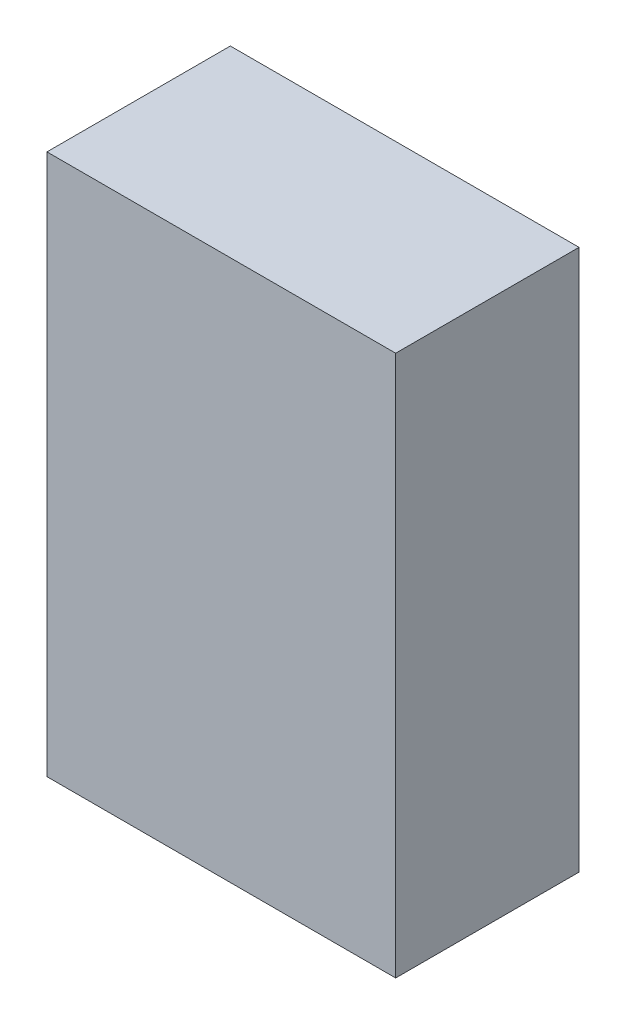
ISO-10303-21;
HEADER;
FILE_DESCRIPTION(('STEP AP214'),'2;1');
FILE_NAME('part.step','',(''),(''),'','','');
FILE_SCHEMA(('AUTOMOTIVE_DESIGN { 1 0 10303 214 1 1 1 1 }'));
ENDSEC;
DATA;
#1=APPLICATION_CONTEXT('core data for automotive mechanical design processes');
#2=APPLICATION_PROTOCOL_DEFINITION('international standard','automotive_design',2000,#1);
#3=PRODUCT_CONTEXT('',#1,'mechanical');
#4=PRODUCT('Part','Part','',(#3));
#5=PRODUCT_RELATED_PRODUCT_CATEGORY('part','',(#4));
#6=PRODUCT_DEFINITION_FORMATION('','',#4);
#7=PRODUCT_DEFINITION_CONTEXT('part definition',#1,'design');
#8=PRODUCT_DEFINITION('design','',#6,#7);
#9=PRODUCT_DEFINITION_SHAPE('','',#8);
#10=(LENGTH_UNIT() NAMED_UNIT(*) SI_UNIT(.MILLI.,.METRE.));
#11=(NAMED_UNIT(*) PLANE_ANGLE_UNIT() SI_UNIT($,.RADIAN.));
#12=(NAMED_UNIT(*) SI_UNIT($,.STERADIAN.) SOLID_ANGLE_UNIT());
#13=UNCERTAINTY_MEASURE_WITH_UNIT(LENGTH_MEASURE(1.E-05),#10,'distance_accuracy_value','');
#14=(GEOMETRIC_REPRESENTATION_CONTEXT(3) GLOBAL_UNCERTAINTY_ASSIGNED_CONTEXT((#13)) GLOBAL_UNIT_ASSIGNED_CONTEXT((#10,
#11,#12)) REPRESENTATION_CONTEXT('',''));
#15=CARTESIAN_POINT('',(0.,0.,0.));
#16=DIRECTION('',(0.,0.,1.));
#17=DIRECTION('',(1.,0.,0.));
#18=AXIS2_PLACEMENT_3D('',#15,#16,#17);
#19=CARTESIAN_POINT('',(-5.8,-9.,6.1));
#20=DIRECTION('',(0.,0.,1.));
#21=DIRECTION('',(1.,0.,0.));
#22=AXIS2_PLACEMENT_3D('',#19,#20,#21);
#23=PLANE('',#22);
#24=DIRECTION('',(0.,1.,0.));
#25=VECTOR('',#24,1.);
#26=CARTESIAN_POINT('',(-5.8,-9.,6.1));
#27=LINE('',#26,#25);
#28=CARTESIAN_POINT('',(-5.8,-9.,6.1));
#29=VERTEX_POINT('',#28);
#30=CARTESIAN_POINT('',(-5.8,9.,6.1));
#31=VERTEX_POINT('',#30);
#32=EDGE_CURVE('E88',#29,#31,#27,.T.);
#33=ORIENTED_EDGE('',*,*,#32,.F.);
#34=DIRECTION('',(1.,0.,0.));
#35=VECTOR('',#34,1.);
#36=CARTESIAN_POINT('',(-5.8,-9.,6.1));
#37=LINE('',#36,#35);
#38=CARTESIAN_POINT('',(5.8,-9.,6.1));
#39=VERTEX_POINT('',#38);
#40=EDGE_CURVE('E72',#29,#39,#37,.T.);
#41=ORIENTED_EDGE('',*,*,#40,.T.);
#42=DIRECTION('',(0.,1.,0.));
#43=VECTOR('',#42,1.);
#44=CARTESIAN_POINT('',(5.8,-9.,6.1));
#45=LINE('',#44,#43);
#46=CARTESIAN_POINT('',(5.8,9.,6.1));
#47=VERTEX_POINT('',#46);
#48=EDGE_CURVE('E18',#39,#47,#45,.T.);
#49=ORIENTED_EDGE('',*,*,#48,.T.);
#50=DIRECTION('',(1.,0.,0.));
#51=VECTOR('',#50,1.);
#52=CARTESIAN_POINT('',(-5.8,9.,6.1));
#53=LINE('',#52,#51);
#54=EDGE_CURVE('E9',#31,#47,#53,.T.);
#55=ORIENTED_EDGE('',*,*,#54,.F.);
#56=EDGE_LOOP('',(#33,#41,#49,#55));
#57=FACE_BOUND('',#56,.T.);
#58=ADVANCED_FACE('F14',(#57),#23,.T.);
#59=CARTESIAN_POINT('',(-5.8,-9.,0.));
#60=DIRECTION('',(0.,0.,1.));
#61=DIRECTION('',(1.,0.,0.));
#62=AXIS2_PLACEMENT_3D('',#59,#60,#61);
#63=PLANE('',#62);
#64=DIRECTION('',(1.,0.,0.));
#65=VECTOR('',#64,1.);
#66=CARTESIAN_POINT('',(-5.8,9.,0.));
#67=LINE('',#66,#65);
#68=CARTESIAN_POINT('',(-5.8,9.,0.));
#69=VERTEX_POINT('',#68);
#70=CARTESIAN_POINT('',(5.8,9.,0.));
#71=VERTEX_POINT('',#70);
#72=EDGE_CURVE('E24',#69,#71,#67,.T.);
#73=ORIENTED_EDGE('',*,*,#72,.T.);
#74=DIRECTION('',(0.,1.,0.));
#75=VECTOR('',#74,1.);
#76=CARTESIAN_POINT('',(5.8,-9.,0.));
#77=LINE('',#76,#75);
#78=CARTESIAN_POINT('',(5.8,-9.,0.));
#79=VERTEX_POINT('',#78);
#80=EDGE_CURVE('E103',#79,#71,#77,.T.);
#81=ORIENTED_EDGE('',*,*,#80,.F.);
#82=DIRECTION('',(1.,0.,0.));
#83=VECTOR('',#82,1.);
#84=CARTESIAN_POINT('',(-5.8,-9.,0.));
#85=LINE('',#84,#83);
#86=CARTESIAN_POINT('',(-5.8,-9.,0.));
#87=VERTEX_POINT('',#86);
#88=EDGE_CURVE('E59',#87,#79,#85,.T.);
#89=ORIENTED_EDGE('',*,*,#88,.F.);
#90=DIRECTION('',(0.,1.,0.));
#91=VECTOR('',#90,1.);
#92=CARTESIAN_POINT('',(-5.8,-9.,0.));
#93=LINE('',#92,#91);
#94=EDGE_CURVE('E89',#87,#69,#93,.T.);
#95=ORIENTED_EDGE('',*,*,#94,.T.);
#96=EDGE_LOOP('',(#73,#81,#89,#95));
#97=FACE_BOUND('',#96,.T.);
#98=ADVANCED_FACE('F183',(#97),#63,.F.);
#99=CARTESIAN_POINT('',(-5.8,9.,0.));
#100=DIRECTION('',(0.,1.,0.));
#101=DIRECTION('',(1.,0.,0.));
#102=AXIS2_PLACEMENT_3D('',#99,#100,#101);
#103=PLANE('',#102);
#104=ORIENTED_EDGE('',*,*,#72,.F.);
#105=DIRECTION('',(0.,0.,1.));
#106=VECTOR('',#105,1.);
#107=CARTESIAN_POINT('',(-5.8,9.,0.));
#108=LINE('',#107,#106);
#109=EDGE_CURVE('E93',#69,#31,#108,.T.);
#110=ORIENTED_EDGE('',*,*,#109,.T.);
#111=ORIENTED_EDGE('',*,*,#54,.T.);
#112=DIRECTION('',(0.,0.,1.));
#113=VECTOR('',#112,1.);
#114=CARTESIAN_POINT('',(5.8,9.,0.));
#115=LINE('',#114,#113);
#116=EDGE_CURVE('E106',#71,#47,#115,.T.);
#117=ORIENTED_EDGE('',*,*,#116,.F.);
#118=EDGE_LOOP('',(#104,#110,#111,#117));
#119=FACE_BOUND('',#118,.T.);
#120=ADVANCED_FACE('F16',(#119),#103,.T.);
#121=CARTESIAN_POINT('',(-5.8,-9.,0.));
#122=DIRECTION('',(0.,1.,0.));
#123=DIRECTION('',(1.,0.,0.));
#124=AXIS2_PLACEMENT_3D('',#121,#122,#123);
#125=PLANE('',#124);
#126=DIRECTION('',(0.,0.,1.));
#127=VECTOR('',#126,1.);
#128=CARTESIAN_POINT('',(5.8,-9.,0.));
#129=LINE('',#128,#127);
#130=EDGE_CURVE('E78',#79,#39,#129,.T.);
#131=ORIENTED_EDGE('',*,*,#130,.T.);
#132=ORIENTED_EDGE('',*,*,#40,.F.);
#133=DIRECTION('',(0.,0.,1.));
#134=VECTOR('',#133,1.);
#135=CARTESIAN_POINT('',(-5.8,-9.,0.));
#136=LINE('',#135,#134);
#137=EDGE_CURVE('E75',#87,#29,#136,.T.);
#138=ORIENTED_EDGE('',*,*,#137,.F.);
#139=ORIENTED_EDGE('',*,*,#88,.T.);
#140=EDGE_LOOP('',(#131,#132,#138,#139));
#141=FACE_BOUND('',#140,.T.);
#142=ADVANCED_FACE('F74',(#141),#125,.F.);
#143=CARTESIAN_POINT('',(5.8,-9.,0.));
#144=DIRECTION('',(1.,0.,0.));
#145=DIRECTION('',(0.,1.,0.));
#146=AXIS2_PLACEMENT_3D('',#143,#144,#145);
#147=PLANE('',#146);
#148=ORIENTED_EDGE('',*,*,#130,.F.);
#149=ORIENTED_EDGE('',*,*,#80,.T.);
#150=ORIENTED_EDGE('',*,*,#116,.T.);
#151=ORIENTED_EDGE('',*,*,#48,.F.);
#152=EDGE_LOOP('',(#148,#149,#150,#151));
#153=FACE_BOUND('',#152,.T.);
#154=ADVANCED_FACE('F160',(#153),#147,.T.);
#155=CARTESIAN_POINT('',(-5.8,-9.,0.));
#156=DIRECTION('',(1.,0.,0.));
#157=DIRECTION('',(0.,1.,0.));
#158=AXIS2_PLACEMENT_3D('',#155,#156,#157);
#159=PLANE('',#158);
#160=ORIENTED_EDGE('',*,*,#32,.T.);
#161=ORIENTED_EDGE('',*,*,#109,.F.);
#162=ORIENTED_EDGE('',*,*,#94,.F.);
#163=ORIENTED_EDGE('',*,*,#137,.T.);
#164=EDGE_LOOP('',(#160,#161,#162,#163));
#165=FACE_BOUND('',#164,.T.);
#166=ADVANCED_FACE('F86',(#165),#159,.F.);
#167=CLOSED_SHELL('',(#58,#98,#120,#142,#154,#166));
#168=MANIFOLD_SOLID_BREP('B1',#167);
#169=ADVANCED_BREP_SHAPE_REPRESENTATION('',(#18,#168),#14);
#170=SHAPE_DEFINITION_REPRESENTATION(#9,#169);
ENDSEC;
END-ISO-10303-21;
